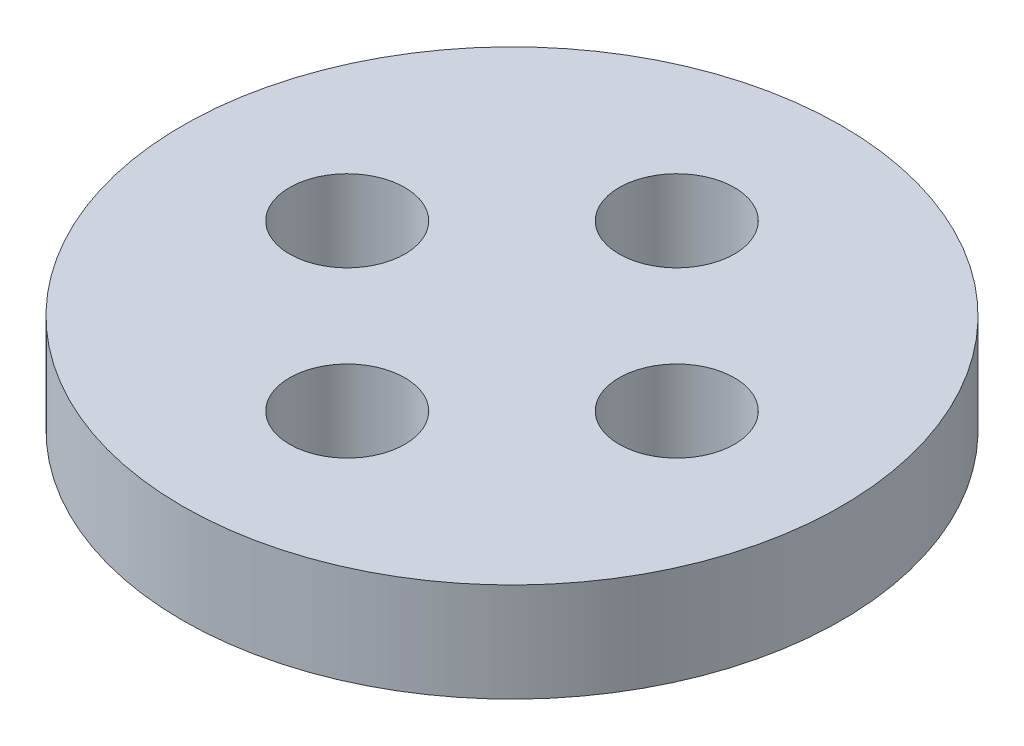
ISO-10303-21;
HEADER;
FILE_DESCRIPTION(('STEP AP214'),'2;1');
FILE_NAME('part.step','',(''),(''),'','','');
FILE_SCHEMA(('AUTOMOTIVE_DESIGN { 1 0 10303 214 1 1 1 1 }'));
ENDSEC;
DATA;
#1=APPLICATION_CONTEXT('core data for automotive mechanical design processes');
#2=APPLICATION_PROTOCOL_DEFINITION('international standard','automotive_design',2000,#1);
#3=PRODUCT_CONTEXT('',#1,'mechanical');
#4=PRODUCT('Part','Part','',(#3));
#5=PRODUCT_RELATED_PRODUCT_CATEGORY('part','',(#4));
#6=PRODUCT_DEFINITION_FORMATION('','',#4);
#7=PRODUCT_DEFINITION_CONTEXT('part definition',#1,'design');
#8=PRODUCT_DEFINITION('design','',#6,#7);
#9=PRODUCT_DEFINITION_SHAPE('','',#8);
#10=(LENGTH_UNIT() NAMED_UNIT(*) SI_UNIT(.MILLI.,.METRE.));
#11=(NAMED_UNIT(*) PLANE_ANGLE_UNIT() SI_UNIT($,.RADIAN.));
#12=(NAMED_UNIT(*) SI_UNIT($,.STERADIAN.) SOLID_ANGLE_UNIT());
#13=UNCERTAINTY_MEASURE_WITH_UNIT(LENGTH_MEASURE(1.E-05),#10,'distance_accuracy_value','');
#14=(GEOMETRIC_REPRESENTATION_CONTEXT(3) GLOBAL_UNCERTAINTY_ASSIGNED_CONTEXT((#13)) GLOBAL_UNIT_ASSIGNED_CONTEXT((#10,
#11,#12)) REPRESENTATION_CONTEXT('',''));
#15=CARTESIAN_POINT('',(0.,0.,0.));
#16=DIRECTION('',(0.,0.,1.));
#17=DIRECTION('',(1.,0.,0.));
#18=AXIS2_PLACEMENT_3D('',#15,#16,#17);
#19=CARTESIAN_POINT('',(0.,3.,0.));
#20=DIRECTION('',(0.,1.,0.));
#21=DIRECTION('',(0.,0.,1.));
#22=AXIS2_PLACEMENT_3D('',#19,#20,#21);
#23=PLANE('',#22);
#24=CARTESIAN_POINT('',(0.,3.,5.));
#25=DIRECTION('',(0.,1.,0.));
#26=DIRECTION('',(0.,0.,1.));
#27=AXIS2_PLACEMENT_3D('',#24,#25,#26);
#28=CIRCLE('',#27,1.74999999999996);
#29=CARTESIAN_POINT('',(0.,3.,6.74999999999996));
#30=VERTEX_POINT('',#29);
#31=EDGE_CURVE('E68',#30,#30,#28,.T.);
#32=ORIENTED_EDGE('',*,*,#31,.F.);
#33=EDGE_LOOP('',(#32));
#34=FACE_BOUND('',#33,.T.);
#35=CARTESIAN_POINT('',(0.,3.,-5.));
#36=DIRECTION('',(0.,1.,0.));
#37=DIRECTION('',(0.,0.,1.));
#38=AXIS2_PLACEMENT_3D('',#35,#36,#37);
#39=CIRCLE('',#38,1.75);
#40=CARTESIAN_POINT('',(0.,3.,-3.25));
#41=VERTEX_POINT('',#40);
#42=EDGE_CURVE('E54',#41,#41,#39,.T.);
#43=ORIENTED_EDGE('',*,*,#42,.F.);
#44=EDGE_LOOP('',(#43));
#45=FACE_BOUND('',#44,.T.);
#46=CARTESIAN_POINT('',(0.,3.,0.));
#47=DIRECTION('',(0.,1.,0.));
#48=DIRECTION('',(0.,0.,1.));
#49=AXIS2_PLACEMENT_3D('',#46,#47,#48);
#50=CIRCLE('',#49,10.);
#51=CARTESIAN_POINT('',(0.,3.,10.));
#52=VERTEX_POINT('',#51);
#53=EDGE_CURVE('E10',#52,#52,#50,.T.);
#54=ORIENTED_EDGE('',*,*,#53,.T.);
#55=EDGE_LOOP('',(#54));
#56=FACE_BOUND('',#55,.T.);
#57=CARTESIAN_POINT('',(5.,3.,0.));
#58=DIRECTION('',(0.,1.,0.));
#59=DIRECTION('',(0.,0.,1.));
#60=AXIS2_PLACEMENT_3D('',#57,#58,#59);
#61=CIRCLE('',#60,1.75);
#62=CARTESIAN_POINT('',(5.,3.,1.75000000000002));
#63=VERTEX_POINT('',#62);
#64=EDGE_CURVE('E60',#63,#63,#61,.T.);
#65=ORIENTED_EDGE('',*,*,#64,.F.);
#66=EDGE_LOOP('',(#65));
#67=FACE_BOUND('',#66,.T.);
#68=CARTESIAN_POINT('',(-5.00000000000004,3.,0.));
#69=DIRECTION('',(0.,1.,0.));
#70=DIRECTION('',(0.,0.,1.));
#71=AXIS2_PLACEMENT_3D('',#68,#69,#70);
#72=CIRCLE('',#71,1.75);
#73=CARTESIAN_POINT('',(-5.00000000000004,3.,1.74999999999997));
#74=VERTEX_POINT('',#73);
#75=EDGE_CURVE('E76',#74,#74,#72,.T.);
#76=ORIENTED_EDGE('',*,*,#75,.F.);
#77=EDGE_LOOP('',(#76));
#78=FACE_BOUND('',#77,.T.);
#79=ADVANCED_FACE('F41',(#34,#45,#56,#67,#78),#23,.T.);
#80=CARTESIAN_POINT('',(0.,0.,0.));
#81=DIRECTION('',(0.,1.,0.));
#82=DIRECTION('',(0.,0.,1.));
#83=AXIS2_PLACEMENT_3D('',#80,#81,#82);
#84=PLANE('',#83);
#85=CARTESIAN_POINT('',(0.,0.,0.));
#86=DIRECTION('',(0.,1.,0.));
#87=DIRECTION('',(0.,0.,1.));
#88=AXIS2_PLACEMENT_3D('',#85,#86,#87);
#89=CIRCLE('',#88,10.);
#90=CARTESIAN_POINT('',(0.,0.,10.));
#91=VERTEX_POINT('',#90);
#92=EDGE_CURVE('E45',#91,#91,#89,.T.);
#93=ORIENTED_EDGE('',*,*,#92,.F.);
#94=EDGE_LOOP('',(#93));
#95=FACE_BOUND('',#94,.T.);
#96=CARTESIAN_POINT('',(0.,0.,-5.));
#97=DIRECTION('',(0.,1.,0.));
#98=DIRECTION('',(0.,0.,1.));
#99=AXIS2_PLACEMENT_3D('',#96,#97,#98);
#100=CIRCLE('',#99,1.75);
#101=CARTESIAN_POINT('',(0.,0.,-3.25));
#102=VERTEX_POINT('',#101);
#103=EDGE_CURVE('E56',#102,#102,#100,.T.);
#104=ORIENTED_EDGE('',*,*,#103,.T.);
#105=EDGE_LOOP('',(#104));
#106=FACE_BOUND('',#105,.T.);
#107=CARTESIAN_POINT('',(5.,0.,0.));
#108=DIRECTION('',(0.,1.,0.));
#109=DIRECTION('',(0.,0.,1.));
#110=AXIS2_PLACEMENT_3D('',#107,#108,#109);
#111=CIRCLE('',#110,1.75);
#112=CARTESIAN_POINT('',(5.,0.,1.75000000000002));
#113=VERTEX_POINT('',#112);
#114=EDGE_CURVE('E64',#113,#113,#111,.T.);
#115=ORIENTED_EDGE('',*,*,#114,.T.);
#116=EDGE_LOOP('',(#115));
#117=FACE_BOUND('',#116,.T.);
#118=CARTESIAN_POINT('',(0.,0.,5.));
#119=DIRECTION('',(0.,1.,0.));
#120=DIRECTION('',(0.,0.,1.));
#121=AXIS2_PLACEMENT_3D('',#118,#119,#120);
#122=CIRCLE('',#121,1.74999999999996);
#123=CARTESIAN_POINT('',(0.,0.,6.74999999999996));
#124=VERTEX_POINT('',#123);
#125=EDGE_CURVE('E72',#124,#124,#122,.T.);
#126=ORIENTED_EDGE('',*,*,#125,.T.);
#127=EDGE_LOOP('',(#126));
#128=FACE_BOUND('',#127,.T.);
#129=CARTESIAN_POINT('',(-5.00000000000004,0.,0.));
#130=DIRECTION('',(0.,1.,0.));
#131=DIRECTION('',(0.,0.,1.));
#132=AXIS2_PLACEMENT_3D('',#129,#130,#131);
#133=CIRCLE('',#132,1.75);
#134=CARTESIAN_POINT('',(-5.00000000000004,0.,1.74999999999997));
#135=VERTEX_POINT('',#134);
#136=EDGE_CURVE('E80',#135,#135,#133,.T.);
#137=ORIENTED_EDGE('',*,*,#136,.T.);
#138=EDGE_LOOP('',(#137));
#139=FACE_BOUND('',#138,.T.);
#140=ADVANCED_FACE('F92',(#95,#106,#117,#128,#139),#84,.F.);
#141=CARTESIAN_POINT('',(0.,3.,0.));
#142=DIRECTION('',(0.,-1.,0.));
#143=DIRECTION('',(0.,0.,-1.));
#144=AXIS2_PLACEMENT_3D('',#141,#142,#143);
#145=CYLINDRICAL_SURFACE('',#144,10.);
#146=ORIENTED_EDGE('',*,*,#53,.F.);
#147=EDGE_LOOP('',(#146));
#148=FACE_BOUND('',#147,.T.);
#149=ORIENTED_EDGE('',*,*,#92,.T.);
#150=EDGE_LOOP('',(#149));
#151=FACE_BOUND('',#150,.T.);
#152=ADVANCED_FACE('F43',(#148,#151),#145,.T.);
#153=CARTESIAN_POINT('',(0.,3.,-5.));
#154=DIRECTION('',(0.,-1.,0.));
#155=DIRECTION('',(0.,0.,-1.));
#156=AXIS2_PLACEMENT_3D('',#153,#154,#155);
#157=CYLINDRICAL_SURFACE('',#156,1.75);
#158=ORIENTED_EDGE('',*,*,#42,.T.);
#159=EDGE_LOOP('',(#158));
#160=FACE_BOUND('',#159,.T.);
#161=ORIENTED_EDGE('',*,*,#103,.F.);
#162=EDGE_LOOP('',(#161));
#163=FACE_BOUND('',#162,.T.);
#164=ADVANCED_FACE('F102',(#160,#163),#157,.F.);
#165=CARTESIAN_POINT('',(5.,3.,0.));
#166=DIRECTION('',(0.,-1.,0.));
#167=DIRECTION('',(0.,0.,-1.));
#168=AXIS2_PLACEMENT_3D('',#165,#166,#167);
#169=CYLINDRICAL_SURFACE('',#168,1.75);
#170=ORIENTED_EDGE('',*,*,#64,.T.);
#171=EDGE_LOOP('',(#170));
#172=FACE_BOUND('',#171,.T.);
#173=ORIENTED_EDGE('',*,*,#114,.F.);
#174=EDGE_LOOP('',(#173));
#175=FACE_BOUND('',#174,.T.);
#176=ADVANCED_FACE('F105',(#172,#175),#169,.F.);
#177=CARTESIAN_POINT('',(0.,3.,5.));
#178=DIRECTION('',(0.,-1.,0.));
#179=DIRECTION('',(0.,0.,-1.));
#180=AXIS2_PLACEMENT_3D('',#177,#178,#179);
#181=CYLINDRICAL_SURFACE('',#180,1.74999999999996);
#182=ORIENTED_EDGE('',*,*,#31,.T.);
#183=EDGE_LOOP('',(#182));
#184=FACE_BOUND('',#183,.T.);
#185=ORIENTED_EDGE('',*,*,#125,.F.);
#186=EDGE_LOOP('',(#185));
#187=FACE_BOUND('',#186,.T.);
#188=ADVANCED_FACE('F109',(#184,#187),#181,.F.);
#189=CARTESIAN_POINT('',(-5.00000000000004,3.,0.));
#190=DIRECTION('',(0.,-1.,0.));
#191=DIRECTION('',(0.,0.,-1.));
#192=AXIS2_PLACEMENT_3D('',#189,#190,#191);
#193=CYLINDRICAL_SURFACE('',#192,1.75);
#194=ORIENTED_EDGE('',*,*,#75,.T.);
#195=EDGE_LOOP('',(#194));
#196=FACE_BOUND('',#195,.T.);
#197=ORIENTED_EDGE('',*,*,#136,.F.);
#198=EDGE_LOOP('',(#197));
#199=FACE_BOUND('',#198,.T.);
#200=ADVANCED_FACE('F88',(#196,#199),#193,.F.);
#201=CLOSED_SHELL('',(#79,#140,#152,#164,#176,#188,#200));
#202=MANIFOLD_SOLID_BREP('B2',#201);
#203=ADVANCED_BREP_SHAPE_REPRESENTATION('',(#18,#202),#14);
#204=SHAPE_DEFINITION_REPRESENTATION(#9,#203);
ENDSEC;
END-ISO-10303-21;
